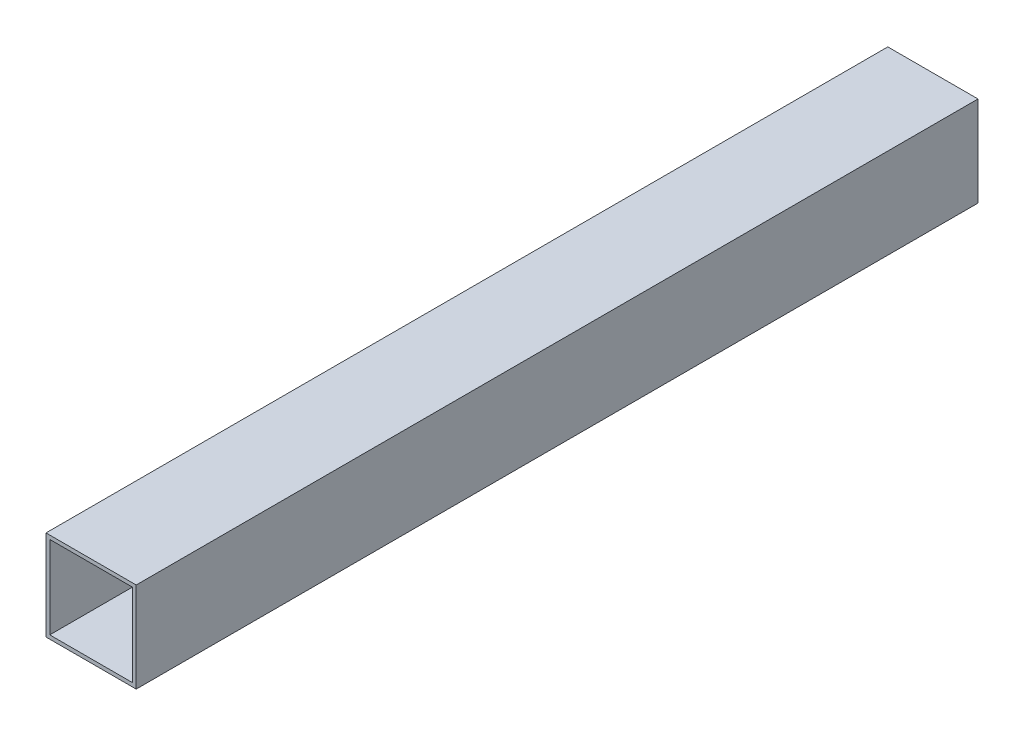
ISO-10303-21;
HEADER;
FILE_DESCRIPTION(('STEP AP214'),'2;1');
FILE_NAME('part.step','',(''),(''),'','','');
FILE_SCHEMA(('AUTOMOTIVE_DESIGN { 1 0 10303 214 1 1 1 1 }'));
ENDSEC;
DATA;
#1=APPLICATION_CONTEXT('core data for automotive mechanical design processes');
#2=APPLICATION_PROTOCOL_DEFINITION('international standard','automotive_design',2000,#1);
#3=PRODUCT_CONTEXT('',#1,'mechanical');
#4=PRODUCT('Part','Part','',(#3));
#5=PRODUCT_RELATED_PRODUCT_CATEGORY('part','',(#4));
#6=PRODUCT_DEFINITION_FORMATION('','',#4);
#7=PRODUCT_DEFINITION_CONTEXT('part definition',#1,'design');
#8=PRODUCT_DEFINITION('design','',#6,#7);
#9=PRODUCT_DEFINITION_SHAPE('','',#8);
#10=(LENGTH_UNIT() NAMED_UNIT(*) SI_UNIT(.MILLI.,.METRE.));
#11=(NAMED_UNIT(*) PLANE_ANGLE_UNIT() SI_UNIT($,.RADIAN.));
#12=(NAMED_UNIT(*) SI_UNIT($,.STERADIAN.) SOLID_ANGLE_UNIT());
#13=UNCERTAINTY_MEASURE_WITH_UNIT(LENGTH_MEASURE(1.E-05),#10,'distance_accuracy_value','');
#14=(GEOMETRIC_REPRESENTATION_CONTEXT(3) GLOBAL_UNCERTAINTY_ASSIGNED_CONTEXT((#13)) GLOBAL_UNIT_ASSIGNED_CONTEXT((#10,
#11,#12)) REPRESENTATION_CONTEXT('',''));
#15=CARTESIAN_POINT('',(0.,0.,0.));
#16=DIRECTION('',(0.,0.,1.));
#17=DIRECTION('',(1.,0.,0.));
#18=AXIS2_PLACEMENT_3D('',#15,#16,#17);
#19=CARTESIAN_POINT('',(0.,0.,711.2));
#20=DIRECTION('',(0.,0.,-1.));
#21=DIRECTION('',(-1.,0.,0.));
#22=AXIS2_PLACEMENT_3D('',#19,#20,#21);
#23=PLANE('',#22);
#24=DIRECTION('',(1.,0.,0.));
#25=VECTOR('',#24,1.);
#26=CARTESIAN_POINT('',(-40.7297095879192,18.6309754178664,711.2));
#27=LINE('',#26,#25);
#28=CARTESIAN_POINT('',(-40.7297095879192,18.6309754178664,711.2));
#29=VERTEX_POINT('',#28);
#30=CARTESIAN_POINT('',(35.4702904120808,18.6309754178664,711.2));
#31=VERTEX_POINT('',#30);
#32=EDGE_CURVE('E132',#29,#31,#27,.T.);
#33=ORIENTED_EDGE('',*,*,#32,.F.);
#34=DIRECTION('',(0.,-1.,0.));
#35=VECTOR('',#34,1.);
#36=CARTESIAN_POINT('',(-40.7297095879192,18.6309754178664,711.2));
#37=LINE('',#36,#35);
#38=CARTESIAN_POINT('',(-40.7297095879192,-57.5690245821336,711.2));
#39=VERTEX_POINT('',#38);
#40=EDGE_CURVE('E141',#29,#39,#37,.T.);
#41=ORIENTED_EDGE('',*,*,#40,.T.);
#42=DIRECTION('',(1.,0.,0.));
#43=VECTOR('',#42,1.);
#44=CARTESIAN_POINT('',(-40.7297095879192,-57.5690245821336,711.2));
#45=LINE('',#44,#43);
#46=CARTESIAN_POINT('',(35.4702904120808,-57.5690245821336,711.2));
#47=VERTEX_POINT('',#46);
#48=EDGE_CURVE('E139',#39,#47,#45,.T.);
#49=ORIENTED_EDGE('',*,*,#48,.T.);
#50=DIRECTION('',(0.,-1.,0.));
#51=VECTOR('',#50,1.);
#52=CARTESIAN_POINT('',(35.4702904120808,18.6309754178664,711.2));
#53=LINE('',#52,#51);
#54=EDGE_CURVE('E135',#31,#47,#53,.T.);
#55=ORIENTED_EDGE('',*,*,#54,.F.);
#56=EDGE_LOOP('',(#33,#41,#49,#55));
#57=FACE_BOUND('',#56,.T.);
#58=DIRECTION('',(1.,0.,0.));
#59=VECTOR('',#58,1.);
#60=CARTESIAN_POINT('',(-37.5547095879192,15.4559754178664,711.2));
#61=LINE('',#60,#59);
#62=CARTESIAN_POINT('',(-37.5547095879192,15.4559754178664,711.2));
#63=VERTEX_POINT('',#62);
#64=CARTESIAN_POINT('',(32.2952904120808,15.4559754178664,711.2));
#65=VERTEX_POINT('',#64);
#66=EDGE_CURVE('E56',#63,#65,#61,.T.);
#67=ORIENTED_EDGE('',*,*,#66,.T.);
#68=DIRECTION('',(0.,-1.,0.));
#69=VECTOR('',#68,1.);
#70=CARTESIAN_POINT('',(32.2952904120808,15.4559754178664,711.2));
#71=LINE('',#70,#69);
#72=CARTESIAN_POINT('',(32.2952904120808,-54.3940245821336,711.2));
#73=VERTEX_POINT('',#72);
#74=EDGE_CURVE('E114',#65,#73,#71,.T.);
#75=ORIENTED_EDGE('',*,*,#74,.T.);
#76=DIRECTION('',(1.,0.,0.));
#77=VECTOR('',#76,1.);
#78=CARTESIAN_POINT('',(-37.5547095879192,-54.3940245821336,711.2));
#79=LINE('',#78,#77);
#80=CARTESIAN_POINT('',(-37.5547095879192,-54.3940245821336,711.2));
#81=VERTEX_POINT('',#80);
#82=EDGE_CURVE('E120',#81,#73,#79,.T.);
#83=ORIENTED_EDGE('',*,*,#82,.F.);
#84=DIRECTION('',(0.,-1.,0.));
#85=VECTOR('',#84,1.);
#86=CARTESIAN_POINT('',(-37.5547095879192,15.4559754178664,711.2));
#87=LINE('',#86,#85);
#88=EDGE_CURVE('E123',#63,#81,#87,.T.);
#89=ORIENTED_EDGE('',*,*,#88,.F.);
#90=EDGE_LOOP('',(#67,#75,#83,#89));
#91=FACE_BOUND('',#90,.T.);
#92=ADVANCED_FACE('F41',(#57,#91),#23,.F.);
#93=CARTESIAN_POINT('',(0.,0.,0.));
#94=DIRECTION('',(0.,0.,-1.));
#95=DIRECTION('',(-1.,0.,0.));
#96=AXIS2_PLACEMENT_3D('',#93,#94,#95);
#97=PLANE('',#96);
#98=DIRECTION('',(1.,0.,0.));
#99=VECTOR('',#98,1.);
#100=CARTESIAN_POINT('',(-40.7297095879192,18.6309754178664,0.));
#101=LINE('',#100,#99);
#102=CARTESIAN_POINT('',(-40.7297095879192,18.6309754178664,0.));
#103=VERTEX_POINT('',#102);
#104=CARTESIAN_POINT('',(35.4702904120808,18.6309754178664,0.));
#105=VERTEX_POINT('',#104);
#106=EDGE_CURVE('E110',#103,#105,#101,.T.);
#107=ORIENTED_EDGE('',*,*,#106,.T.);
#108=DIRECTION('',(0.,-1.,0.));
#109=VECTOR('',#108,1.);
#110=CARTESIAN_POINT('',(35.4702904120808,18.6309754178664,0.));
#111=LINE('',#110,#109);
#112=CARTESIAN_POINT('',(35.4702904120808,-57.5690245821336,0.));
#113=VERTEX_POINT('',#112);
#114=EDGE_CURVE('E146',#105,#113,#111,.T.);
#115=ORIENTED_EDGE('',*,*,#114,.T.);
#116=DIRECTION('',(1.,0.,0.));
#117=VECTOR('',#116,1.);
#118=CARTESIAN_POINT('',(-40.7297095879192,-57.5690245821336,0.));
#119=LINE('',#118,#117);
#120=CARTESIAN_POINT('',(-40.7297095879192,-57.5690245821336,0.));
#121=VERTEX_POINT('',#120);
#122=EDGE_CURVE('E149',#121,#113,#119,.T.);
#123=ORIENTED_EDGE('',*,*,#122,.F.);
#124=DIRECTION('',(0.,-1.,0.));
#125=VECTOR('',#124,1.);
#126=CARTESIAN_POINT('',(-40.7297095879192,18.6309754178664,0.));
#127=LINE('',#126,#125);
#128=EDGE_CURVE('E136',#103,#121,#127,.T.);
#129=ORIENTED_EDGE('',*,*,#128,.F.);
#130=EDGE_LOOP('',(#107,#115,#123,#129));
#131=FACE_BOUND('',#130,.T.);
#132=DIRECTION('',(0.,1.,0.));
#133=VECTOR('',#132,1.);
#134=CARTESIAN_POINT('',(32.2952904120808,0.,0.));
#135=LINE('',#134,#133);
#136=CARTESIAN_POINT('',(32.2952904120808,-54.3940245821336,0.));
#137=VERTEX_POINT('',#136);
#138=CARTESIAN_POINT('',(32.2952904120808,15.4559754178664,0.));
#139=VERTEX_POINT('',#138);
#140=EDGE_CURVE('E49',#137,#139,#135,.T.);
#141=ORIENTED_EDGE('',*,*,#140,.T.);
#142=DIRECTION('',(-1.,0.,0.));
#143=VECTOR('',#142,1.);
#144=CARTESIAN_POINT('',(0.,15.4559754178664,0.));
#145=LINE('',#144,#143);
#146=CARTESIAN_POINT('',(-37.5547095879192,15.4559754178664,0.));
#147=VERTEX_POINT('',#146);
#148=EDGE_CURVE('E11',#139,#147,#145,.T.);
#149=ORIENTED_EDGE('',*,*,#148,.T.);
#150=DIRECTION('',(0.,1.,0.));
#151=VECTOR('',#150,1.);
#152=CARTESIAN_POINT('',(-37.5547095879192,0.,0.));
#153=LINE('',#152,#151);
#154=CARTESIAN_POINT('',(-37.5547095879192,-54.3940245821336,0.));
#155=VERTEX_POINT('',#154);
#156=EDGE_CURVE('E155',#155,#147,#153,.T.);
#157=ORIENTED_EDGE('',*,*,#156,.F.);
#158=DIRECTION('',(-1.,0.,0.));
#159=VECTOR('',#158,1.);
#160=CARTESIAN_POINT('',(0.,-54.3940245821336,0.));
#161=LINE('',#160,#159);
#162=EDGE_CURVE('E163',#137,#155,#161,.T.);
#163=ORIENTED_EDGE('',*,*,#162,.F.);
#164=EDGE_LOOP('',(#141,#149,#157,#163));
#165=FACE_BOUND('',#164,.T.);
#166=ADVANCED_FACE('F166',(#131,#165),#97,.T.);
#167=CARTESIAN_POINT('',(-40.7297095879192,18.6309754178664,711.2));
#168=DIRECTION('',(0.,1.,0.));
#169=DIRECTION('',(0.,0.,1.));
#170=AXIS2_PLACEMENT_3D('',#167,#168,#169);
#171=PLANE('',#170);
#172=ORIENTED_EDGE('',*,*,#106,.F.);
#173=DIRECTION('',(0.,0.,-1.));
#174=VECTOR('',#173,1.);
#175=CARTESIAN_POINT('',(-40.7297095879192,18.6309754178664,711.2));
#176=LINE('',#175,#174);
#177=EDGE_CURVE('E153',#29,#103,#176,.T.);
#178=ORIENTED_EDGE('',*,*,#177,.F.);
#179=ORIENTED_EDGE('',*,*,#32,.T.);
#180=DIRECTION('',(0.,0.,-1.));
#181=VECTOR('',#180,1.);
#182=CARTESIAN_POINT('',(35.4702904120808,18.6309754178664,711.2));
#183=LINE('',#182,#181);
#184=EDGE_CURVE('E143',#31,#105,#183,.T.);
#185=ORIENTED_EDGE('',*,*,#184,.T.);
#186=EDGE_LOOP('',(#172,#178,#179,#185));
#187=FACE_BOUND('',#186,.T.);
#188=ADVANCED_FACE('F43',(#187),#171,.T.);
#189=CARTESIAN_POINT('',(-40.7297095879192,18.6309754178664,711.2));
#190=DIRECTION('',(1.,0.,0.));
#191=DIRECTION('',(0.,0.,-1.));
#192=AXIS2_PLACEMENT_3D('',#189,#190,#191);
#193=PLANE('',#192);
#194=ORIENTED_EDGE('',*,*,#128,.T.);
#195=DIRECTION('',(0.,0.,-1.));
#196=VECTOR('',#195,1.);
#197=CARTESIAN_POINT('',(-40.7297095879192,-57.5690245821336,711.2));
#198=LINE('',#197,#196);
#199=EDGE_CURVE('E156',#39,#121,#198,.T.);
#200=ORIENTED_EDGE('',*,*,#199,.F.);
#201=ORIENTED_EDGE('',*,*,#40,.F.);
#202=ORIENTED_EDGE('',*,*,#177,.T.);
#203=EDGE_LOOP('',(#194,#200,#201,#202));
#204=FACE_BOUND('',#203,.T.);
#205=ADVANCED_FACE('F190',(#204),#193,.F.);
#206=CARTESIAN_POINT('',(-40.7297095879192,-57.5690245821336,711.2));
#207=DIRECTION('',(0.,1.,0.));
#208=DIRECTION('',(-1.,0.,0.));
#209=AXIS2_PLACEMENT_3D('',#206,#207,#208);
#210=PLANE('',#209);
#211=ORIENTED_EDGE('',*,*,#122,.T.);
#212=DIRECTION('',(0.,0.,-1.));
#213=VECTOR('',#212,1.);
#214=CARTESIAN_POINT('',(35.4702904120808,-57.5690245821336,711.2));
#215=LINE('',#214,#213);
#216=EDGE_CURVE('E159',#47,#113,#215,.T.);
#217=ORIENTED_EDGE('',*,*,#216,.F.);
#218=ORIENTED_EDGE('',*,*,#48,.F.);
#219=ORIENTED_EDGE('',*,*,#199,.T.);
#220=EDGE_LOOP('',(#211,#217,#218,#219));
#221=FACE_BOUND('',#220,.T.);
#222=ADVANCED_FACE('F193',(#221),#210,.F.);
#223=CARTESIAN_POINT('',(35.4702904120808,18.6309754178664,711.2));
#224=DIRECTION('',(1.,0.,0.));
#225=DIRECTION('',(0.,0.,-1.));
#226=AXIS2_PLACEMENT_3D('',#223,#224,#225);
#227=PLANE('',#226);
#228=ORIENTED_EDGE('',*,*,#114,.F.);
#229=ORIENTED_EDGE('',*,*,#184,.F.);
#230=ORIENTED_EDGE('',*,*,#54,.T.);
#231=ORIENTED_EDGE('',*,*,#216,.T.);
#232=EDGE_LOOP('',(#228,#229,#230,#231));
#233=FACE_BOUND('',#232,.T.);
#234=ADVANCED_FACE('F196',(#233),#227,.T.);
#235=CARTESIAN_POINT('',(-37.5547095879192,15.4559754178664,-127.));
#236=DIRECTION('',(0.,-1.,0.));
#237=DIRECTION('',(0.,0.,-1.));
#238=AXIS2_PLACEMENT_3D('',#235,#236,#237);
#239=PLANE('',#238);
#240=DIRECTION('',(0.,0.,1.));
#241=VECTOR('',#240,1.);
#242=CARTESIAN_POINT('',(32.2952904120808,15.4559754178664,-127.));
#243=LINE('',#242,#241);
#244=EDGE_CURVE('E105',#139,#65,#243,.T.);
#245=ORIENTED_EDGE('',*,*,#244,.T.);
#246=ORIENTED_EDGE('',*,*,#66,.F.);
#247=DIRECTION('',(0.,0.,1.));
#248=VECTOR('',#247,1.);
#249=CARTESIAN_POINT('',(-37.5547095879192,15.4559754178664,-127.));
#250=LINE('',#249,#248);
#251=EDGE_CURVE('E128',#147,#63,#250,.T.);
#252=ORIENTED_EDGE('',*,*,#251,.F.);
#253=ORIENTED_EDGE('',*,*,#148,.F.);
#254=EDGE_LOOP('',(#245,#246,#252,#253));
#255=FACE_BOUND('',#254,.T.);
#256=ADVANCED_FACE('F107',(#255),#239,.T.);
#257=CARTESIAN_POINT('',(32.2952904120808,15.4559754178664,-127.));
#258=DIRECTION('',(-1.,0.,0.));
#259=DIRECTION('',(0.,-1.,0.));
#260=AXIS2_PLACEMENT_3D('',#257,#258,#259);
#261=PLANE('',#260);
#262=DIRECTION('',(0.,0.,1.));
#263=VECTOR('',#262,1.);
#264=CARTESIAN_POINT('',(32.2952904120808,-54.3940245821336,-127.));
#265=LINE('',#264,#263);
#266=EDGE_CURVE('E111',#137,#73,#265,.T.);
#267=ORIENTED_EDGE('',*,*,#266,.T.);
#268=ORIENTED_EDGE('',*,*,#74,.F.);
#269=ORIENTED_EDGE('',*,*,#244,.F.);
#270=ORIENTED_EDGE('',*,*,#140,.F.);
#271=EDGE_LOOP('',(#267,#268,#269,#270));
#272=FACE_BOUND('',#271,.T.);
#273=ADVANCED_FACE('F115',(#272),#261,.T.);
#274=CARTESIAN_POINT('',(-37.5547095879192,-54.3940245821336,-127.));
#275=DIRECTION('',(0.,-1.,0.));
#276=DIRECTION('',(0.,0.,-1.));
#277=AXIS2_PLACEMENT_3D('',#274,#275,#276);
#278=PLANE('',#277);
#279=ORIENTED_EDGE('',*,*,#162,.T.);
#280=DIRECTION('',(0.,0.,1.));
#281=VECTOR('',#280,1.);
#282=CARTESIAN_POINT('',(-37.5547095879192,-54.3940245821336,-127.));
#283=LINE('',#282,#281);
#284=EDGE_CURVE('E64',#155,#81,#283,.T.);
#285=ORIENTED_EDGE('',*,*,#284,.T.);
#286=ORIENTED_EDGE('',*,*,#82,.T.);
#287=ORIENTED_EDGE('',*,*,#266,.F.);
#288=EDGE_LOOP('',(#279,#285,#286,#287));
#289=FACE_BOUND('',#288,.T.);
#290=ADVANCED_FACE('F169',(#289),#278,.F.);
#291=CARTESIAN_POINT('',(-37.5547095879192,15.4559754178664,-127.));
#292=DIRECTION('',(-1.,0.,0.));
#293=DIRECTION('',(0.,-1.,0.));
#294=AXIS2_PLACEMENT_3D('',#291,#292,#293);
#295=PLANE('',#294);
#296=ORIENTED_EDGE('',*,*,#156,.T.);
#297=ORIENTED_EDGE('',*,*,#251,.T.);
#298=ORIENTED_EDGE('',*,*,#88,.T.);
#299=ORIENTED_EDGE('',*,*,#284,.F.);
#300=EDGE_LOOP('',(#296,#297,#298,#299));
#301=FACE_BOUND('',#300,.T.);
#302=ADVANCED_FACE('F170',(#301),#295,.F.);
#303=CLOSED_SHELL('',(#92,#166,#188,#205,#222,#234,#256,#273,#290,#302));
#304=MANIFOLD_SOLID_BREP('B2',#303);
#305=ADVANCED_BREP_SHAPE_REPRESENTATION('',(#18,#304),#14);
#306=SHAPE_DEFINITION_REPRESENTATION(#9,#305);
ENDSEC;
END-ISO-10303-21;
